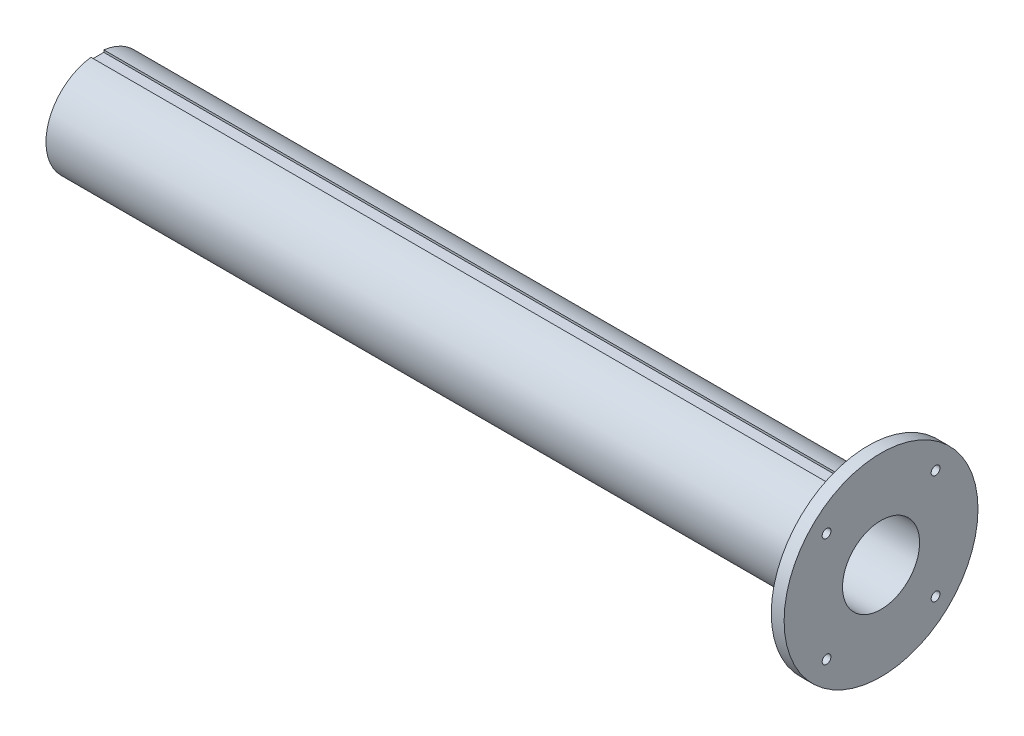
ISO-10303-21;
HEADER;
FILE_DESCRIPTION(('STEP AP214'),'2;1');
FILE_NAME('part.step','',(''),(''),'','','');
FILE_SCHEMA(('AUTOMOTIVE_DESIGN { 1 0 10303 214 1 1 1 1 }'));
ENDSEC;
DATA;
#1=APPLICATION_CONTEXT('core data for automotive mechanical design processes');
#2=APPLICATION_PROTOCOL_DEFINITION('international standard','automotive_design',2000,#1);
#3=PRODUCT_CONTEXT('',#1,'mechanical');
#4=PRODUCT('Part','Part','',(#3));
#5=PRODUCT_RELATED_PRODUCT_CATEGORY('part','',(#4));
#6=PRODUCT_DEFINITION_FORMATION('','',#4);
#7=PRODUCT_DEFINITION_CONTEXT('part definition',#1,'design');
#8=PRODUCT_DEFINITION('design','',#6,#7);
#9=PRODUCT_DEFINITION_SHAPE('','',#8);
#10=(LENGTH_UNIT() NAMED_UNIT(*) SI_UNIT(.MILLI.,.METRE.));
#11=(NAMED_UNIT(*) PLANE_ANGLE_UNIT() SI_UNIT($,.RADIAN.));
#12=(NAMED_UNIT(*) SI_UNIT($,.STERADIAN.) SOLID_ANGLE_UNIT());
#13=UNCERTAINTY_MEASURE_WITH_UNIT(LENGTH_MEASURE(1.E-05),#10,'distance_accuracy_value','');
#14=(GEOMETRIC_REPRESENTATION_CONTEXT(3) GLOBAL_UNCERTAINTY_ASSIGNED_CONTEXT((#13)) GLOBAL_UNIT_ASSIGNED_CONTEXT((#10,
#11,#12)) REPRESENTATION_CONTEXT('',''));
#15=CARTESIAN_POINT('',(0.,0.,0.));
#16=DIRECTION('',(0.,0.,1.));
#17=DIRECTION('',(1.,0.,0.));
#18=AXIS2_PLACEMENT_3D('',#15,#16,#17);
#19=CARTESIAN_POINT('',(-148.458149779736,40.,0.));
#20=DIRECTION('',(-1.,0.,0.));
#21=DIRECTION('',(0.,0.,1.));
#22=AXIS2_PLACEMENT_3D('',#19,#20,#21);
#23=CYLINDRICAL_SURFACE('',#22,40.);
#24=DIRECTION('',(-1.,0.,0.));
#25=VECTOR('',#24,1.);
#26=CARTESIAN_POINT('',(-148.458149779736,79.6862696659689,4.99999999999998));
#27=LINE('',#26,#25);
#28=CARTESIAN_POINT('',(-108.271234449894,79.6862696659689,4.99999999999998));
#29=VERTEX_POINT('',#28);
#30=CARTESIAN_POINT('',(491.728765550106,79.6862696659689,4.99999999999998));
#31=VERTEX_POINT('',#30);
#32=EDGE_CURVE('E60',#29,#31,#27,.F.);
#33=ORIENTED_EDGE('',*,*,#32,.F.);
#34=CARTESIAN_POINT('',(-108.271234449894,40.,0.));
#35=DIRECTION('',(-1.,0.,0.));
#36=DIRECTION('',(0.,0.,1.));
#37=AXIS2_PLACEMENT_3D('',#34,#35,#36);
#38=CIRCLE('',#37,40.);
#39=CARTESIAN_POINT('',(-108.271234449894,79.6862696659689,-5.00000000000002));
#40=VERTEX_POINT('',#39);
#41=EDGE_CURVE('E11',#40,#29,#38,.T.);
#42=ORIENTED_EDGE('',*,*,#41,.F.);
#43=DIRECTION('',(-1.,0.,0.));
#44=VECTOR('',#43,1.);
#45=CARTESIAN_POINT('',(-148.458149779736,79.6862696659689,-5.00000000000002));
#46=LINE('',#45,#44);
#47=CARTESIAN_POINT('',(491.728765550106,79.6862696659689,-5.00000000000002));
#48=VERTEX_POINT('',#47);
#49=EDGE_CURVE('E52',#48,#40,#46,.T.);
#50=ORIENTED_EDGE('',*,*,#49,.F.);
#51=CARTESIAN_POINT('',(491.728765550106,40.,0.));
#52=DIRECTION('',(-1.,0.,0.));
#53=DIRECTION('',(0.,0.,1.));
#54=AXIS2_PLACEMENT_3D('',#51,#52,#53);
#55=CIRCLE('',#54,40.);
#56=EDGE_CURVE('E86',#48,#31,#55,.T.);
#57=ORIENTED_EDGE('',*,*,#56,.T.);
#58=EDGE_LOOP('',(#33,#42,#50,#57));
#59=FACE_BOUND('',#58,.T.);
#60=ADVANCED_FACE('F36',(#59),#23,.T.);
#61=CARTESIAN_POINT('',(-108.271234449894,10.,0.));
#62=DIRECTION('',(-1.,0.,0.));
#63=DIRECTION('',(0.,0.,1.));
#64=AXIS2_PLACEMENT_3D('',#61,#62,#63);
#65=PLANE('',#64);
#66=DIRECTION('',(0.,1.,0.));
#67=VECTOR('',#66,1.);
#68=CARTESIAN_POINT('',(-108.271234449894,82.,4.99999999999998));
#69=LINE('',#68,#67);
#70=CARTESIAN_POINT('',(-108.271234449894,78.,4.99999999999999));
#71=VERTEX_POINT('',#70);
#72=EDGE_CURVE('E102',#71,#29,#69,.T.);
#73=ORIENTED_EDGE('',*,*,#72,.F.);
#74=DIRECTION('',(0.,0.,1.));
#75=VECTOR('',#74,1.);
#76=CARTESIAN_POINT('',(-108.271234449894,78.,-5.00000000000002));
#77=LINE('',#76,#75);
#78=CARTESIAN_POINT('',(-108.271234449894,78.,-5.00000000000002));
#79=VERTEX_POINT('',#78);
#80=EDGE_CURVE('E106',#79,#71,#77,.T.);
#81=ORIENTED_EDGE('',*,*,#80,.F.);
#82=DIRECTION('',(0.,-1.,0.));
#83=VECTOR('',#82,1.);
#84=CARTESIAN_POINT('',(-108.271234449894,82.,-5.00000000000002));
#85=LINE('',#84,#83);
#86=EDGE_CURVE('E92',#40,#79,#85,.T.);
#87=ORIENTED_EDGE('',*,*,#86,.F.);
#88=ORIENTED_EDGE('',*,*,#41,.T.);
#89=EDGE_LOOP('',(#73,#81,#87,#88));
#90=FACE_BOUND('',#89,.T.);
#91=CARTESIAN_POINT('',(-108.271234449894,40.,0.));
#92=DIRECTION('',(-1.,0.,0.));
#93=DIRECTION('',(0.,0.,1.));
#94=AXIS2_PLACEMENT_3D('',#91,#92,#93);
#95=CIRCLE('',#94,30.);
#96=CARTESIAN_POINT('',(-108.271234449894,40.,30.));
#97=VERTEX_POINT('',#96);
#98=EDGE_CURVE('E44',#97,#97,#95,.T.);
#99=ORIENTED_EDGE('',*,*,#98,.F.);
#100=EDGE_LOOP('',(#99));
#101=FACE_BOUND('',#100,.T.);
#102=ADVANCED_FACE('F145',(#90,#101),#65,.T.);
#103=CARTESIAN_POINT('',(-148.458149779736,40.,0.));
#104=DIRECTION('',(-1.,0.,0.));
#105=DIRECTION('',(0.,0.,1.));
#106=AXIS2_PLACEMENT_3D('',#103,#104,#105);
#107=CYLINDRICAL_SURFACE('',#106,30.);
#108=ORIENTED_EDGE('',*,*,#98,.T.);
#109=EDGE_LOOP('',(#108));
#110=FACE_BOUND('',#109,.T.);
#111=CARTESIAN_POINT('',(501.728765550106,40.,0.));
#112=DIRECTION('',(-1.,0.,0.));
#113=DIRECTION('',(0.,0.,1.));
#114=AXIS2_PLACEMENT_3D('',#111,#112,#113);
#115=CIRCLE('',#114,30.);
#116=CARTESIAN_POINT('',(501.728765550106,40.,30.));
#117=VERTEX_POINT('',#116);
#118=EDGE_CURVE('E118',#117,#117,#115,.T.);
#119=ORIENTED_EDGE('',*,*,#118,.F.);
#120=EDGE_LOOP('',(#119));
#121=FACE_BOUND('',#120,.T.);
#122=ADVANCED_FACE('F163',(#110,#121),#107,.F.);
#123=CARTESIAN_POINT('',(501.728765550106,-35.4625550660793,0.));
#124=DIRECTION('',(1.,0.,0.));
#125=DIRECTION('',(0.,0.,-1.));
#126=AXIS2_PLACEMENT_3D('',#123,#124,#125);
#127=PLANE('',#126);
#128=CARTESIAN_POINT('',(501.728765550106,82.4264068711929,42.4264068711929));
#129=DIRECTION('',(1.,0.,0.));
#130=DIRECTION('',(0.,0.,-1.));
#131=AXIS2_PLACEMENT_3D('',#128,#129,#130);
#132=CIRCLE('',#131,3.39999999999999);
#133=CARTESIAN_POINT('',(501.728765550106,82.4264068711929,39.0264068711929));
#134=VERTEX_POINT('',#133);
#135=EDGE_CURVE('E284',#134,#134,#132,.T.);
#136=ORIENTED_EDGE('',*,*,#135,.F.);
#137=EDGE_LOOP('',(#136));
#138=FACE_BOUND('',#137,.T.);
#139=CARTESIAN_POINT('',(501.728765550106,82.4264068711929,-42.4264068711928));
#140=DIRECTION('',(1.,0.,0.));
#141=DIRECTION('',(0.,0.,-1.));
#142=AXIS2_PLACEMENT_3D('',#139,#140,#141);
#143=CIRCLE('',#142,3.39999999999999);
#144=CARTESIAN_POINT('',(501.728765550106,82.4264068711929,-45.8264068711928));
#145=VERTEX_POINT('',#144);
#146=EDGE_CURVE('E136',#145,#145,#143,.T.);
#147=ORIENTED_EDGE('',*,*,#146,.F.);
#148=EDGE_LOOP('',(#147));
#149=FACE_BOUND('',#148,.T.);
#150=CARTESIAN_POINT('',(501.728765550106,-2.42640687119285,-42.4264068711928));
#151=DIRECTION('',(1.,0.,0.));
#152=DIRECTION('',(0.,0.,-1.));
#153=AXIS2_PLACEMENT_3D('',#150,#151,#152);
#154=CIRCLE('',#153,3.39999999999999);
#155=CARTESIAN_POINT('',(501.728765550106,-2.42640687119285,-45.8264068711928));
#156=VERTEX_POINT('',#155);
#157=EDGE_CURVE('E125',#156,#156,#154,.T.);
#158=ORIENTED_EDGE('',*,*,#157,.F.);
#159=EDGE_LOOP('',(#158));
#160=FACE_BOUND('',#159,.T.);
#161=CARTESIAN_POINT('',(501.728765550106,-2.42640687119286,42.4264068711929));
#162=DIRECTION('',(1.,0.,0.));
#163=DIRECTION('',(0.,0.,-1.));
#164=AXIS2_PLACEMENT_3D('',#161,#162,#163);
#165=CIRCLE('',#164,3.39999999999999);
#166=CARTESIAN_POINT('',(501.728765550106,-2.42640687119286,39.0264068711929));
#167=VERTEX_POINT('',#166);
#168=EDGE_CURVE('E124',#167,#167,#165,.T.);
#169=ORIENTED_EDGE('',*,*,#168,.F.);
#170=EDGE_LOOP('',(#169));
#171=FACE_BOUND('',#170,.T.);
#172=ORIENTED_EDGE('',*,*,#118,.T.);
#173=EDGE_LOOP('',(#172));
#174=FACE_BOUND('',#173,.T.);
#175=CARTESIAN_POINT('',(501.728765550106,40.,0.));
#176=DIRECTION('',(-1.,0.,0.));
#177=DIRECTION('',(0.,0.,1.));
#178=AXIS2_PLACEMENT_3D('',#175,#176,#177);
#179=CIRCLE('',#178,75.4625550660793);
#180=CARTESIAN_POINT('',(501.728765550106,40.,75.4625550660793));
#181=VERTEX_POINT('',#180);
#182=EDGE_CURVE('E115',#181,#181,#179,.T.);
#183=ORIENTED_EDGE('',*,*,#182,.F.);
#184=EDGE_LOOP('',(#183));
#185=FACE_BOUND('',#184,.T.);
#186=ADVANCED_FACE('F167',(#138,#149,#160,#171,#174,#185),#127,.T.);
#187=CARTESIAN_POINT('',(-148.458149779736,40.,0.));
#188=DIRECTION('',(-1.,0.,0.));
#189=DIRECTION('',(0.,0.,1.));
#190=AXIS2_PLACEMENT_3D('',#187,#188,#189);
#191=CYLINDRICAL_SURFACE('',#190,75.4625550660793);
#192=ORIENTED_EDGE('',*,*,#182,.T.);
#193=EDGE_LOOP('',(#192));
#194=FACE_BOUND('',#193,.T.);
#195=CARTESIAN_POINT('',(491.728765550106,40.,0.));
#196=DIRECTION('',(-1.,0.,0.));
#197=DIRECTION('',(0.,0.,1.));
#198=AXIS2_PLACEMENT_3D('',#195,#196,#197);
#199=CIRCLE('',#198,75.4625550660793);
#200=CARTESIAN_POINT('',(491.728765550106,40.,75.4625550660793));
#201=VERTEX_POINT('',#200);
#202=EDGE_CURVE('E112',#201,#201,#199,.T.);
#203=ORIENTED_EDGE('',*,*,#202,.F.);
#204=EDGE_LOOP('',(#203));
#205=FACE_BOUND('',#204,.T.);
#206=ADVANCED_FACE('F155',(#194,#205),#191,.T.);
#207=CARTESIAN_POINT('',(491.728765550106,0.,0.));
#208=DIRECTION('',(-1.,0.,0.));
#209=DIRECTION('',(0.,0.,1.));
#210=AXIS2_PLACEMENT_3D('',#207,#208,#209);
#211=PLANE('',#210);
#212=CARTESIAN_POINT('',(491.728765550106,82.4264068711929,42.4264068711929));
#213=DIRECTION('',(-1.,0.,0.));
#214=DIRECTION('',(0.,0.,1.));
#215=AXIS2_PLACEMENT_3D('',#212,#213,#214);
#216=CIRCLE('',#215,3.39999999999999);
#217=CARTESIAN_POINT('',(491.728765550106,82.4264068711929,45.8264068711928));
#218=VERTEX_POINT('',#217);
#219=EDGE_CURVE('E39',#218,#218,#216,.T.);
#220=ORIENTED_EDGE('',*,*,#219,.F.);
#221=EDGE_LOOP('',(#220));
#222=FACE_BOUND('',#221,.T.);
#223=CARTESIAN_POINT('',(491.728765550106,82.4264068711929,-42.4264068711928));
#224=DIRECTION('',(-1.,0.,0.));
#225=DIRECTION('',(0.,0.,1.));
#226=AXIS2_PLACEMENT_3D('',#223,#224,#225);
#227=CIRCLE('',#226,3.39999999999999);
#228=CARTESIAN_POINT('',(491.728765550106,82.4264068711929,-39.0264068711929));
#229=VERTEX_POINT('',#228);
#230=EDGE_CURVE('E131',#229,#229,#227,.T.);
#231=ORIENTED_EDGE('',*,*,#230,.F.);
#232=EDGE_LOOP('',(#231));
#233=FACE_BOUND('',#232,.T.);
#234=CARTESIAN_POINT('',(491.728765550106,-2.42640687119285,-42.4264068711928));
#235=DIRECTION('',(-1.,0.,0.));
#236=DIRECTION('',(0.,0.,1.));
#237=AXIS2_PLACEMENT_3D('',#234,#235,#236);
#238=CIRCLE('',#237,3.39999999999999);
#239=CARTESIAN_POINT('',(491.728765550106,-2.42640687119285,-39.0264068711929));
#240=VERTEX_POINT('',#239);
#241=EDGE_CURVE('E122',#240,#240,#238,.T.);
#242=ORIENTED_EDGE('',*,*,#241,.F.);
#243=EDGE_LOOP('',(#242));
#244=FACE_BOUND('',#243,.T.);
#245=CARTESIAN_POINT('',(491.728765550106,-2.42640687119286,42.4264068711929));
#246=DIRECTION('',(-1.,0.,0.));
#247=DIRECTION('',(0.,0.,1.));
#248=AXIS2_PLACEMENT_3D('',#245,#246,#247);
#249=CIRCLE('',#248,3.39999999999999);
#250=CARTESIAN_POINT('',(491.728765550106,-2.42640687119286,45.8264068711928));
#251=VERTEX_POINT('',#250);
#252=EDGE_CURVE('E104',#251,#251,#249,.T.);
#253=ORIENTED_EDGE('',*,*,#252,.F.);
#254=EDGE_LOOP('',(#253));
#255=FACE_BOUND('',#254,.T.);
#256=ORIENTED_EDGE('',*,*,#56,.F.);
#257=DIRECTION('',(0.,-1.,0.));
#258=VECTOR('',#257,1.);
#259=CARTESIAN_POINT('',(491.728765550106,82.,-5.00000000000002));
#260=LINE('',#259,#258);
#261=CARTESIAN_POINT('',(491.728765550106,78.,-5.00000000000002));
#262=VERTEX_POINT('',#261);
#263=EDGE_CURVE('E79',#48,#262,#260,.T.);
#264=ORIENTED_EDGE('',*,*,#263,.T.);
#265=DIRECTION('',(0.,0.,1.));
#266=VECTOR('',#265,1.);
#267=CARTESIAN_POINT('',(491.728765550106,78.,-5.00000000000002));
#268=LINE('',#267,#266);
#269=CARTESIAN_POINT('',(491.728765550106,78.,4.99999999999999));
#270=VERTEX_POINT('',#269);
#271=EDGE_CURVE('E84',#262,#270,#268,.T.);
#272=ORIENTED_EDGE('',*,*,#271,.T.);
#273=DIRECTION('',(0.,1.,0.));
#274=VECTOR('',#273,1.);
#275=CARTESIAN_POINT('',(491.728765550106,82.,4.99999999999998));
#276=LINE('',#275,#274);
#277=EDGE_CURVE('E87',#270,#31,#276,.T.);
#278=ORIENTED_EDGE('',*,*,#277,.T.);
#279=EDGE_LOOP('',(#256,#264,#272,#278));
#280=FACE_BOUND('',#279,.T.);
#281=ORIENTED_EDGE('',*,*,#202,.T.);
#282=EDGE_LOOP('',(#281));
#283=FACE_BOUND('',#282,.T.);
#284=ADVANCED_FACE('F81',(#222,#233,#244,#255,#280,#283),#211,.T.);
#285=CARTESIAN_POINT('',(491.728765550106,82.,4.99999999999998));
#286=DIRECTION('',(0.,0.,1.));
#287=DIRECTION('',(0.,-1.,0.));
#288=AXIS2_PLACEMENT_3D('',#285,#286,#287);
#289=PLANE('',#288);
#290=ORIENTED_EDGE('',*,*,#32,.T.);
#291=ORIENTED_EDGE('',*,*,#277,.F.);
#292=DIRECTION('',(-1.,0.,0.));
#293=VECTOR('',#292,1.);
#294=CARTESIAN_POINT('',(491.728765550106,78.,4.99999999999999));
#295=LINE('',#294,#293);
#296=EDGE_CURVE('E96',#270,#71,#295,.T.);
#297=ORIENTED_EDGE('',*,*,#296,.T.);
#298=ORIENTED_EDGE('',*,*,#72,.T.);
#299=EDGE_LOOP('',(#290,#291,#297,#298));
#300=FACE_BOUND('',#299,.T.);
#301=ADVANCED_FACE('F147',(#300),#289,.F.);
#302=CARTESIAN_POINT('',(491.728765550106,78.,-5.00000000000002));
#303=DIRECTION('',(0.,-1.,0.));
#304=DIRECTION('',(0.,0.,-1.));
#305=AXIS2_PLACEMENT_3D('',#302,#303,#304);
#306=PLANE('',#305);
#307=ORIENTED_EDGE('',*,*,#80,.T.);
#308=ORIENTED_EDGE('',*,*,#296,.F.);
#309=ORIENTED_EDGE('',*,*,#271,.F.);
#310=DIRECTION('',(-1.,0.,0.));
#311=VECTOR('',#310,1.);
#312=CARTESIAN_POINT('',(491.728765550106,78.,-5.00000000000002));
#313=LINE('',#312,#311);
#314=EDGE_CURVE('E90',#262,#79,#313,.T.);
#315=ORIENTED_EDGE('',*,*,#314,.T.);
#316=EDGE_LOOP('',(#307,#308,#309,#315));
#317=FACE_BOUND('',#316,.T.);
#318=ADVANCED_FACE('F98',(#317),#306,.F.);
#319=CARTESIAN_POINT('',(491.728765550106,82.,-5.00000000000002));
#320=DIRECTION('',(0.,0.,-1.));
#321=DIRECTION('',(0.,1.,0.));
#322=AXIS2_PLACEMENT_3D('',#319,#320,#321);
#323=PLANE('',#322);
#324=ORIENTED_EDGE('',*,*,#49,.T.);
#325=ORIENTED_EDGE('',*,*,#86,.T.);
#326=ORIENTED_EDGE('',*,*,#314,.F.);
#327=ORIENTED_EDGE('',*,*,#263,.F.);
#328=EDGE_LOOP('',(#324,#325,#326,#327));
#329=FACE_BOUND('',#328,.T.);
#330=ADVANCED_FACE('F91',(#329),#323,.F.);
#331=CARTESIAN_POINT('',(501.728765550106,-2.42640687119286,42.4264068711929));
#332=DIRECTION('',(1.,0.,0.));
#333=DIRECTION('',(0.,0.,-1.));
#334=AXIS2_PLACEMENT_3D('',#331,#332,#333);
#335=CYLINDRICAL_SURFACE('',#334,3.39999999999999);
#336=ORIENTED_EDGE('',*,*,#252,.T.);
#337=EDGE_LOOP('',(#336));
#338=FACE_BOUND('',#337,.T.);
#339=ORIENTED_EDGE('',*,*,#168,.T.);
#340=EDGE_LOOP('',(#339));
#341=FACE_BOUND('',#340,.T.);
#342=ADVANCED_FACE('F199',(#338,#341),#335,.F.);
#343=CARTESIAN_POINT('',(501.728765550106,-2.42640687119285,-42.4264068711928));
#344=DIRECTION('',(1.,0.,0.));
#345=DIRECTION('',(0.,0.,-1.));
#346=AXIS2_PLACEMENT_3D('',#343,#344,#345);
#347=CYLINDRICAL_SURFACE('',#346,3.39999999999999);
#348=ORIENTED_EDGE('',*,*,#241,.T.);
#349=EDGE_LOOP('',(#348));
#350=FACE_BOUND('',#349,.T.);
#351=ORIENTED_EDGE('',*,*,#157,.T.);
#352=EDGE_LOOP('',(#351));
#353=FACE_BOUND('',#352,.T.);
#354=ADVANCED_FACE('F205',(#350,#353),#347,.F.);
#355=CARTESIAN_POINT('',(501.728765550106,82.4264068711929,-42.4264068711928));
#356=DIRECTION('',(1.,0.,0.));
#357=DIRECTION('',(0.,0.,-1.));
#358=AXIS2_PLACEMENT_3D('',#355,#356,#357);
#359=CYLINDRICAL_SURFACE('',#358,3.39999999999999);
#360=ORIENTED_EDGE('',*,*,#230,.T.);
#361=EDGE_LOOP('',(#360));
#362=FACE_BOUND('',#361,.T.);
#363=ORIENTED_EDGE('',*,*,#146,.T.);
#364=EDGE_LOOP('',(#363));
#365=FACE_BOUND('',#364,.T.);
#366=ADVANCED_FACE('F217',(#362,#365),#359,.F.);
#367=CARTESIAN_POINT('',(501.728765550106,82.4264068711929,42.4264068711929));
#368=DIRECTION('',(1.,0.,0.));
#369=DIRECTION('',(0.,0.,-1.));
#370=AXIS2_PLACEMENT_3D('',#367,#368,#369);
#371=CYLINDRICAL_SURFACE('',#370,3.39999999999999);
#372=ORIENTED_EDGE('',*,*,#219,.T.);
#373=EDGE_LOOP('',(#372));
#374=FACE_BOUND('',#373,.T.);
#375=ORIENTED_EDGE('',*,*,#135,.T.);
#376=EDGE_LOOP('',(#375));
#377=FACE_BOUND('',#376,.T.);
#378=ADVANCED_FACE('F227',(#374,#377),#371,.F.);
#379=CLOSED_SHELL('',(#60,#102,#122,#186,#206,#284,#301,#318,#330,#342,#354,#366,#378));
#380=MANIFOLD_SOLID_BREP('B2',#379);
#381=ADVANCED_BREP_SHAPE_REPRESENTATION('',(#18,#380),#14);
#382=SHAPE_DEFINITION_REPRESENTATION(#9,#381);
ENDSEC;
END-ISO-10303-21;
